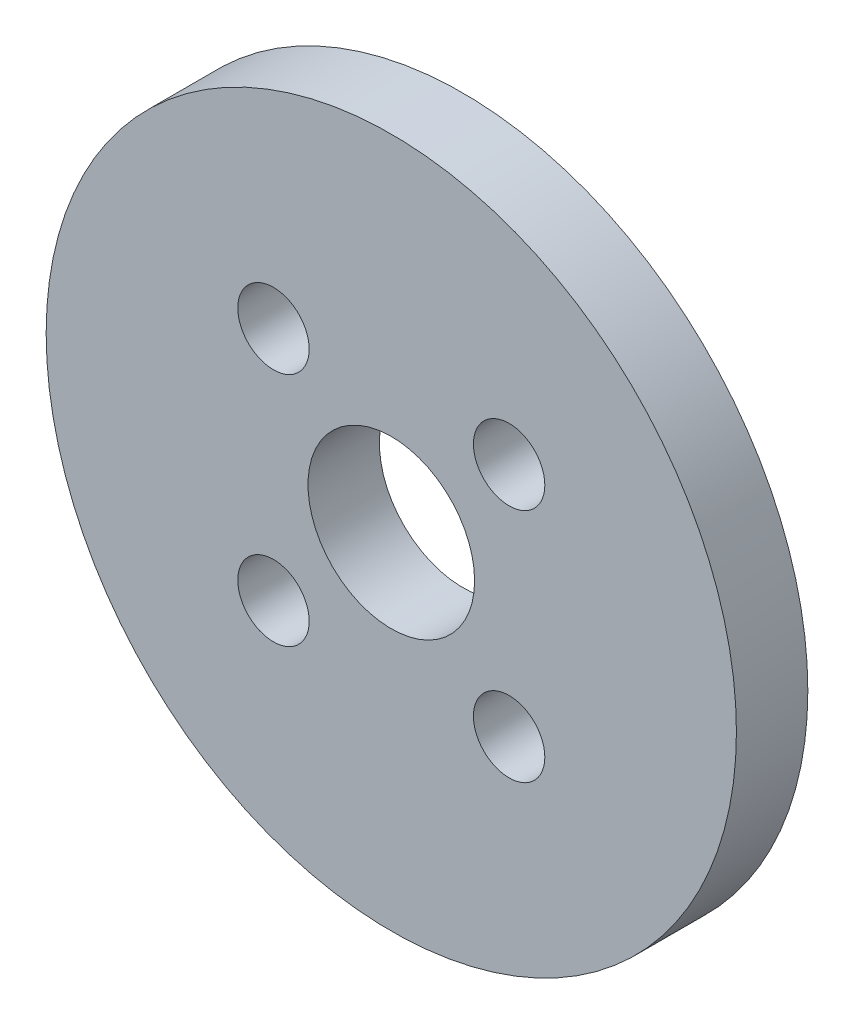
ISO-10303-21;
HEADER;
FILE_DESCRIPTION(('STEP AP214'),'2;1');
FILE_NAME('part.step','',(''),(''),'','','');
FILE_SCHEMA(('AUTOMOTIVE_DESIGN { 1 0 10303 214 1 1 1 1 }'));
ENDSEC;
DATA;
#1=APPLICATION_CONTEXT('core data for automotive mechanical design processes');
#2=APPLICATION_PROTOCOL_DEFINITION('international standard','automotive_design',2000,#1);
#3=PRODUCT_CONTEXT('',#1,'mechanical');
#4=PRODUCT('Part','Part','',(#3));
#5=PRODUCT_RELATED_PRODUCT_CATEGORY('part','',(#4));
#6=PRODUCT_DEFINITION_FORMATION('','',#4);
#7=PRODUCT_DEFINITION_CONTEXT('part definition',#1,'design');
#8=PRODUCT_DEFINITION('design','',#6,#7);
#9=PRODUCT_DEFINITION_SHAPE('','',#8);
#10=(LENGTH_UNIT() NAMED_UNIT(*) SI_UNIT(.MILLI.,.METRE.));
#11=(NAMED_UNIT(*) PLANE_ANGLE_UNIT() SI_UNIT($,.RADIAN.));
#12=(NAMED_UNIT(*) SI_UNIT($,.STERADIAN.) SOLID_ANGLE_UNIT());
#13=UNCERTAINTY_MEASURE_WITH_UNIT(LENGTH_MEASURE(1.E-05),#10,'distance_accuracy_value','');
#14=(GEOMETRIC_REPRESENTATION_CONTEXT(3) GLOBAL_UNCERTAINTY_ASSIGNED_CONTEXT((#13)) GLOBAL_UNIT_ASSIGNED_CONTEXT((#10,
#11,#12)) REPRESENTATION_CONTEXT('',''));
#15=CARTESIAN_POINT('',(0.,0.,0.));
#16=DIRECTION('',(0.,0.,1.));
#17=DIRECTION('',(1.,0.,0.));
#18=AXIS2_PLACEMENT_3D('',#15,#16,#17);
#19=CARTESIAN_POINT('',(0.,0.,3.));
#20=DIRECTION('',(0.,0.,-1.));
#21=DIRECTION('',(-1.,0.,0.));
#22=AXIS2_PLACEMENT_3D('',#19,#20,#21);
#23=CYLINDRICAL_SURFACE('',#22,3.5);
#24=CARTESIAN_POINT('',(0.,0.,3.));
#25=DIRECTION('',(0.,0.,1.));
#26=DIRECTION('',(1.,0.,0.));
#27=AXIS2_PLACEMENT_3D('',#24,#25,#26);
#28=CIRCLE('',#27,3.5);
#29=CARTESIAN_POINT('',(3.5,0.,3.));
#30=VERTEX_POINT('',#29);
#31=EDGE_CURVE('E42',#30,#30,#28,.T.);
#32=ORIENTED_EDGE('',*,*,#31,.T.);
#33=EDGE_LOOP('',(#32));
#34=FACE_BOUND('',#33,.T.);
#35=CARTESIAN_POINT('',(0.,0.,0.));
#36=DIRECTION('',(0.,0.,1.));
#37=DIRECTION('',(1.,0.,0.));
#38=AXIS2_PLACEMENT_3D('',#35,#36,#37);
#39=CIRCLE('',#38,3.5);
#40=CARTESIAN_POINT('',(3.5,0.,0.));
#41=VERTEX_POINT('',#40);
#42=EDGE_CURVE('E62',#41,#41,#39,.T.);
#43=ORIENTED_EDGE('',*,*,#42,.F.);
#44=EDGE_LOOP('',(#43));
#45=FACE_BOUND('',#44,.T.);
#46=ADVANCED_FACE('F34',(#34,#45),#23,.F.);
#47=CARTESIAN_POINT('',(-4.94974746830583,4.94974746830583,3.));
#48=DIRECTION('',(0.,0.,-1.));
#49=DIRECTION('',(-1.,0.,0.));
#50=AXIS2_PLACEMENT_3D('',#47,#48,#49);
#51=CYLINDRICAL_SURFACE('',#50,1.5);
#52=CARTESIAN_POINT('',(-4.94974746830583,4.94974746830583,3.));
#53=DIRECTION('',(0.,0.,1.));
#54=DIRECTION('',(1.,0.,0.));
#55=AXIS2_PLACEMENT_3D('',#52,#53,#54);
#56=CIRCLE('',#55,1.5);
#57=CARTESIAN_POINT('',(-3.44974746830583,4.94974746830583,3.));
#58=VERTEX_POINT('',#57);
#59=EDGE_CURVE('E47',#58,#58,#56,.T.);
#60=ORIENTED_EDGE('',*,*,#59,.T.);
#61=EDGE_LOOP('',(#60));
#62=FACE_BOUND('',#61,.T.);
#63=CARTESIAN_POINT('',(-4.94974746830583,4.94974746830583,0.));
#64=DIRECTION('',(0.,0.,1.));
#65=DIRECTION('',(1.,0.,0.));
#66=AXIS2_PLACEMENT_3D('',#63,#64,#65);
#67=CIRCLE('',#66,1.5);
#68=CARTESIAN_POINT('',(-3.44974746830583,4.94974746830583,0.));
#69=VERTEX_POINT('',#68);
#70=EDGE_CURVE('E60',#69,#69,#67,.T.);
#71=ORIENTED_EDGE('',*,*,#70,.F.);
#72=EDGE_LOOP('',(#71));
#73=FACE_BOUND('',#72,.T.);
#74=ADVANCED_FACE('F83',(#62,#73),#51,.F.);
#75=CARTESIAN_POINT('',(4.94974746830583,4.94974746830583,3.));
#76=DIRECTION('',(0.,0.,-1.));
#77=DIRECTION('',(-1.,0.,0.));
#78=AXIS2_PLACEMENT_3D('',#75,#76,#77);
#79=CYLINDRICAL_SURFACE('',#78,1.5);
#80=CARTESIAN_POINT('',(4.94974746830583,4.94974746830583,3.));
#81=DIRECTION('',(0.,0.,1.));
#82=DIRECTION('',(1.,0.,0.));
#83=AXIS2_PLACEMENT_3D('',#80,#81,#82);
#84=CIRCLE('',#83,1.5);
#85=CARTESIAN_POINT('',(6.44974746830583,4.94974746830583,3.));
#86=VERTEX_POINT('',#85);
#87=EDGE_CURVE('E76',#86,#86,#84,.T.);
#88=ORIENTED_EDGE('',*,*,#87,.T.);
#89=EDGE_LOOP('',(#88));
#90=FACE_BOUND('',#89,.T.);
#91=CARTESIAN_POINT('',(4.94974746830583,4.94974746830583,0.));
#92=DIRECTION('',(0.,0.,1.));
#93=DIRECTION('',(1.,0.,0.));
#94=AXIS2_PLACEMENT_3D('',#91,#92,#93);
#95=CIRCLE('',#94,1.5);
#96=CARTESIAN_POINT('',(6.44974746830583,4.94974746830583,0.));
#97=VERTEX_POINT('',#96);
#98=EDGE_CURVE('E57',#97,#97,#95,.T.);
#99=ORIENTED_EDGE('',*,*,#98,.F.);
#100=EDGE_LOOP('',(#99));
#101=FACE_BOUND('',#100,.T.);
#102=ADVANCED_FACE('F101',(#90,#101),#79,.F.);
#103=CARTESIAN_POINT('',(4.94974746830583,-4.94974746830583,3.));
#104=DIRECTION('',(0.,0.,-1.));
#105=DIRECTION('',(-1.,0.,0.));
#106=AXIS2_PLACEMENT_3D('',#103,#104,#105);
#107=CYLINDRICAL_SURFACE('',#106,1.5);
#108=CARTESIAN_POINT('',(4.94974746830583,-4.94974746830583,3.));
#109=DIRECTION('',(0.,0.,1.));
#110=DIRECTION('',(1.,0.,0.));
#111=AXIS2_PLACEMENT_3D('',#108,#109,#110);
#112=CIRCLE('',#111,1.5);
#113=CARTESIAN_POINT('',(6.44974746830583,-4.94974746830583,3.));
#114=VERTEX_POINT('',#113);
#115=EDGE_CURVE('E71',#114,#114,#112,.T.);
#116=ORIENTED_EDGE('',*,*,#115,.T.);
#117=EDGE_LOOP('',(#116));
#118=FACE_BOUND('',#117,.T.);
#119=CARTESIAN_POINT('',(4.94974746830583,-4.94974746830583,0.));
#120=DIRECTION('',(0.,0.,1.));
#121=DIRECTION('',(1.,0.,0.));
#122=AXIS2_PLACEMENT_3D('',#119,#120,#121);
#123=CIRCLE('',#122,1.5);
#124=CARTESIAN_POINT('',(6.44974746830583,-4.94974746830583,0.));
#125=VERTEX_POINT('',#124);
#126=EDGE_CURVE('E54',#125,#125,#123,.T.);
#127=ORIENTED_EDGE('',*,*,#126,.F.);
#128=EDGE_LOOP('',(#127));
#129=FACE_BOUND('',#128,.T.);
#130=ADVANCED_FACE('F107',(#118,#129),#107,.F.);
#131=CARTESIAN_POINT('',(-4.94974746830583,-4.94974746830583,3.));
#132=DIRECTION('',(0.,0.,-1.));
#133=DIRECTION('',(-1.,0.,0.));
#134=AXIS2_PLACEMENT_3D('',#131,#132,#133);
#135=CYLINDRICAL_SURFACE('',#134,1.5);
#136=CARTESIAN_POINT('',(-4.94974746830583,-4.94974746830583,3.));
#137=DIRECTION('',(0.,0.,1.));
#138=DIRECTION('',(1.,0.,0.));
#139=AXIS2_PLACEMENT_3D('',#136,#137,#138);
#140=CIRCLE('',#139,1.5);
#141=CARTESIAN_POINT('',(-3.44974746830583,-4.94974746830583,3.));
#142=VERTEX_POINT('',#141);
#143=EDGE_CURVE('E67',#142,#142,#140,.T.);
#144=ORIENTED_EDGE('',*,*,#143,.T.);
#145=EDGE_LOOP('',(#144));
#146=FACE_BOUND('',#145,.T.);
#147=CARTESIAN_POINT('',(-4.94974746830583,-4.94974746830583,0.));
#148=DIRECTION('',(0.,0.,1.));
#149=DIRECTION('',(1.,0.,0.));
#150=AXIS2_PLACEMENT_3D('',#147,#148,#149);
#151=CIRCLE('',#150,1.5);
#152=CARTESIAN_POINT('',(-3.44974746830583,-4.94974746830583,0.));
#153=VERTEX_POINT('',#152);
#154=EDGE_CURVE('E51',#153,#153,#151,.T.);
#155=ORIENTED_EDGE('',*,*,#154,.F.);
#156=EDGE_LOOP('',(#155));
#157=FACE_BOUND('',#156,.T.);
#158=ADVANCED_FACE('F36',(#146,#157),#135,.F.);
#159=CARTESIAN_POINT('',(0.,0.,3.));
#160=DIRECTION('',(0.,0.,-1.));
#161=DIRECTION('',(-1.,0.,0.));
#162=AXIS2_PLACEMENT_3D('',#159,#160,#161);
#163=CYLINDRICAL_SURFACE('',#162,14.5);
#164=CARTESIAN_POINT('',(0.,0.,3.));
#165=DIRECTION('',(0.,0.,1.));
#166=DIRECTION('',(1.,0.,0.));
#167=AXIS2_PLACEMENT_3D('',#164,#165,#166);
#168=CIRCLE('',#167,14.5);
#169=CARTESIAN_POINT('',(14.5,0.,3.));
#170=VERTEX_POINT('',#169);
#171=EDGE_CURVE('E10',#170,#170,#168,.T.);
#172=ORIENTED_EDGE('',*,*,#171,.F.);
#173=EDGE_LOOP('',(#172));
#174=FACE_BOUND('',#173,.T.);
#175=CARTESIAN_POINT('',(0.,0.,0.));
#176=DIRECTION('',(0.,0.,1.));
#177=DIRECTION('',(1.,0.,0.));
#178=AXIS2_PLACEMENT_3D('',#175,#176,#177);
#179=CIRCLE('',#178,14.5);
#180=CARTESIAN_POINT('',(14.5,0.,0.));
#181=VERTEX_POINT('',#180);
#182=EDGE_CURVE('E38',#181,#181,#179,.T.);
#183=ORIENTED_EDGE('',*,*,#182,.T.);
#184=EDGE_LOOP('',(#183));
#185=FACE_BOUND('',#184,.T.);
#186=ADVANCED_FACE('F90',(#174,#185),#163,.T.);
#187=CARTESIAN_POINT('',(0.,0.,3.));
#188=DIRECTION('',(0.,0.,1.));
#189=DIRECTION('',(1.,0.,0.));
#190=AXIS2_PLACEMENT_3D('',#187,#188,#189);
#191=PLANE('',#190);
#192=ORIENTED_EDGE('',*,*,#143,.F.);
#193=EDGE_LOOP('',(#192));
#194=FACE_BOUND('',#193,.T.);
#195=ORIENTED_EDGE('',*,*,#115,.F.);
#196=EDGE_LOOP('',(#195));
#197=FACE_BOUND('',#196,.T.);
#198=ORIENTED_EDGE('',*,*,#87,.F.);
#199=EDGE_LOOP('',(#198));
#200=FACE_BOUND('',#199,.T.);
#201=ORIENTED_EDGE('',*,*,#59,.F.);
#202=EDGE_LOOP('',(#201));
#203=FACE_BOUND('',#202,.T.);
#204=ORIENTED_EDGE('',*,*,#31,.F.);
#205=EDGE_LOOP('',(#204));
#206=FACE_BOUND('',#205,.T.);
#207=ORIENTED_EDGE('',*,*,#171,.T.);
#208=EDGE_LOOP('',(#207));
#209=FACE_BOUND('',#208,.T.);
#210=ADVANCED_FACE('F86',(#194,#197,#200,#203,#206,#209),#191,.T.);
#211=CARTESIAN_POINT('',(0.,0.,0.));
#212=DIRECTION('',(0.,0.,1.));
#213=DIRECTION('',(1.,0.,0.));
#214=AXIS2_PLACEMENT_3D('',#211,#212,#213);
#215=PLANE('',#214);
#216=ORIENTED_EDGE('',*,*,#154,.T.);
#217=EDGE_LOOP('',(#216));
#218=FACE_BOUND('',#217,.T.);
#219=ORIENTED_EDGE('',*,*,#126,.T.);
#220=EDGE_LOOP('',(#219));
#221=FACE_BOUND('',#220,.T.);
#222=ORIENTED_EDGE('',*,*,#98,.T.);
#223=EDGE_LOOP('',(#222));
#224=FACE_BOUND('',#223,.T.);
#225=ORIENTED_EDGE('',*,*,#70,.T.);
#226=EDGE_LOOP('',(#225));
#227=FACE_BOUND('',#226,.T.);
#228=ORIENTED_EDGE('',*,*,#42,.T.);
#229=EDGE_LOOP('',(#228));
#230=FACE_BOUND('',#229,.T.);
#231=ORIENTED_EDGE('',*,*,#182,.F.);
#232=EDGE_LOOP('',(#231));
#233=FACE_BOUND('',#232,.T.);
#234=ADVANCED_FACE('F89',(#218,#221,#224,#227,#230,#233),#215,.F.);
#235=CLOSED_SHELL('',(#46,#74,#102,#130,#158,#186,#210,#234));
#236=MANIFOLD_SOLID_BREP('B2',#235);
#237=ADVANCED_BREP_SHAPE_REPRESENTATION('',(#18,#236),#14);
#238=SHAPE_DEFINITION_REPRESENTATION(#9,#237);
ENDSEC;
END-ISO-10303-21;
